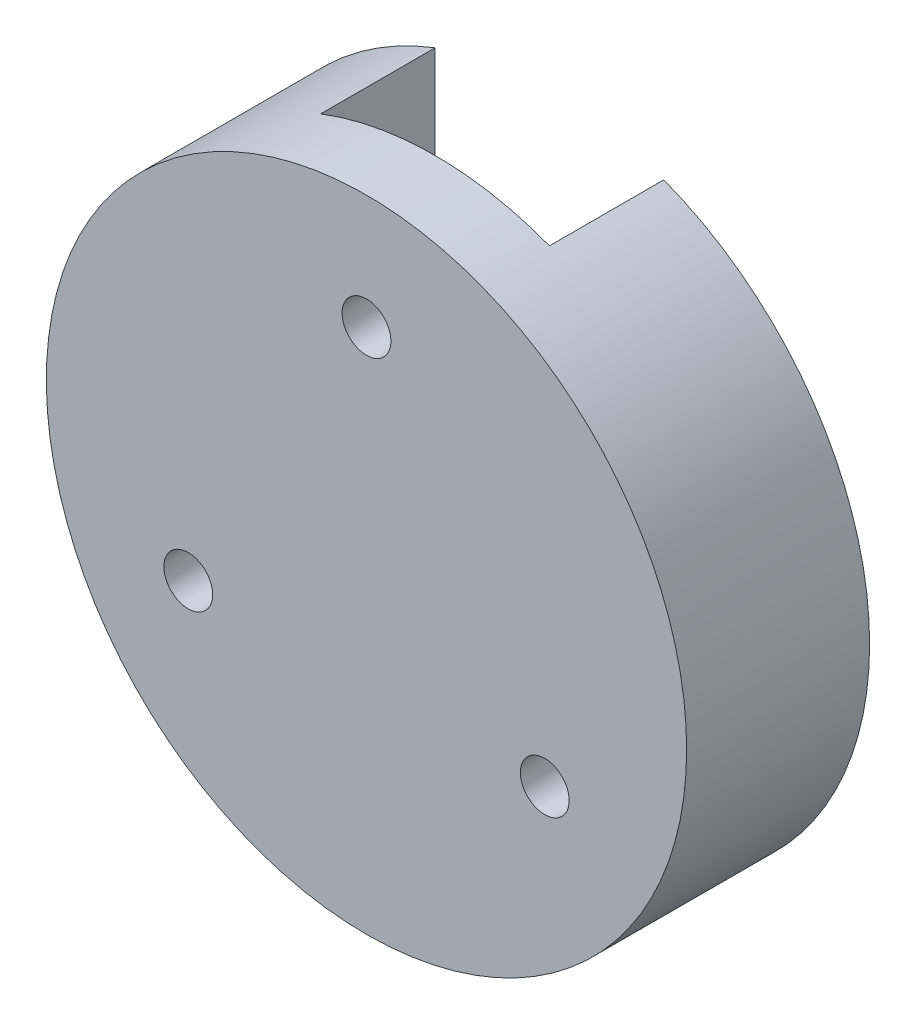
ISO-10303-21;
HEADER;
FILE_DESCRIPTION(('STEP AP214'),'2;1');
FILE_NAME('part.step','',(''),(''),'','','');
FILE_SCHEMA(('AUTOMOTIVE_DESIGN { 1 0 10303 214 1 1 1 1 }'));
ENDSEC;
DATA;
#1=APPLICATION_CONTEXT('core data for automotive mechanical design processes');
#2=APPLICATION_PROTOCOL_DEFINITION('international standard','automotive_design',2000,#1);
#3=PRODUCT_CONTEXT('',#1,'mechanical');
#4=PRODUCT('Part','Part','',(#3));
#5=PRODUCT_RELATED_PRODUCT_CATEGORY('part','',(#4));
#6=PRODUCT_DEFINITION_FORMATION('','',#4);
#7=PRODUCT_DEFINITION_CONTEXT('part definition',#1,'design');
#8=PRODUCT_DEFINITION('design','',#6,#7);
#9=PRODUCT_DEFINITION_SHAPE('','',#8);
#10=(LENGTH_UNIT() NAMED_UNIT(*) SI_UNIT(.MILLI.,.METRE.));
#11=(NAMED_UNIT(*) PLANE_ANGLE_UNIT() SI_UNIT($,.RADIAN.));
#12=(NAMED_UNIT(*) SI_UNIT($,.STERADIAN.) SOLID_ANGLE_UNIT());
#13=UNCERTAINTY_MEASURE_WITH_UNIT(LENGTH_MEASURE(1.E-05),#10,'distance_accuracy_value','');
#14=(GEOMETRIC_REPRESENTATION_CONTEXT(3) GLOBAL_UNCERTAINTY_ASSIGNED_CONTEXT((#13)) GLOBAL_UNIT_ASSIGNED_CONTEXT((#10,
#11,#12)) REPRESENTATION_CONTEXT('',''));
#15=CARTESIAN_POINT('',(0.,0.,0.));
#16=DIRECTION('',(0.,0.,1.));
#17=DIRECTION('',(1.,0.,0.));
#18=AXIS2_PLACEMENT_3D('',#15,#16,#17);
#19=CARTESIAN_POINT('',(0.,0.,-9.));
#20=DIRECTION('',(0.,0.,-1.));
#21=DIRECTION('',(-1.,0.,0.));
#22=AXIS2_PLACEMENT_3D('',#19,#20,#21);
#23=PLANE('',#22);
#24=DIRECTION('',(0.,1.,0.));
#25=VECTOR('',#24,1.);
#26=CARTESIAN_POINT('',(-7.5,-25.,-9.));
#27=LINE('',#26,#25);
#28=CARTESIAN_POINT('',(-7.5,-19.615045245933,-9.));
#29=VERTEX_POINT('',#28);
#30=CARTESIAN_POINT('',(-7.5,19.615045245933,-9.));
#31=VERTEX_POINT('',#30);
#32=EDGE_CURVE('E91',#29,#31,#27,.T.);
#33=ORIENTED_EDGE('',*,*,#32,.F.);
#34=CARTESIAN_POINT('',(0.,0.,-9.));
#35=DIRECTION('',(0.,0.,-1.));
#36=DIRECTION('',(-1.,0.,0.));
#37=AXIS2_PLACEMENT_3D('',#34,#35,#36);
#38=CIRCLE('',#37,21.);
#39=EDGE_CURVE('E104',#29,#31,#38,.T.);
#40=ORIENTED_EDGE('',*,*,#39,.T.);
#41=EDGE_LOOP('',(#33,#40));
#42=FACE_BOUND('',#41,.T.);
#43=CARTESIAN_POINT('',(-11.6913429510908,-6.7499999999995,-9.));
#44=DIRECTION('',(0.,0.,-1.));
#45=DIRECTION('',(-1.,0.,0.));
#46=AXIS2_PLACEMENT_3D('',#43,#44,#45);
#47=CIRCLE('',#46,1.6);
#48=CARTESIAN_POINT('',(-13.2913429510908,-6.7499999999995,-9.));
#49=VERTEX_POINT('',#48);
#50=EDGE_CURVE('E127',#49,#49,#47,.T.);
#51=ORIENTED_EDGE('',*,*,#50,.F.);
#52=EDGE_LOOP('',(#51));
#53=FACE_BOUND('',#52,.T.);
#54=ADVANCED_FACE('F45',(#42,#53),#23,.T.);
#55=CARTESIAN_POINT('',(0.,0.,3.));
#56=DIRECTION('',(0.,0.,-1.));
#57=DIRECTION('',(-1.,0.,0.));
#58=AXIS2_PLACEMENT_3D('',#55,#56,#57);
#59=CYLINDRICAL_SURFACE('',#58,21.);
#60=CARTESIAN_POINT('',(0.,0.,-1.5));
#61=DIRECTION('',(0.,0.,1.));
#62=DIRECTION('',(1.,0.,0.));
#63=AXIS2_PLACEMENT_3D('',#60,#61,#62);
#64=CIRCLE('',#63,21.);
#65=CARTESIAN_POINT('',(7.5,19.615045245933,-1.5));
#66=VERTEX_POINT('',#65);
#67=CARTESIAN_POINT('',(-7.5,19.615045245933,-1.5));
#68=VERTEX_POINT('',#67);
#69=EDGE_CURVE('E141',#66,#68,#64,.T.);
#70=ORIENTED_EDGE('',*,*,#69,.T.);
#71=DIRECTION('',(0.,0.,-1.));
#72=VECTOR('',#71,1.);
#73=CARTESIAN_POINT('',(-7.5,19.615045245933,3.));
#74=LINE('',#73,#72);
#75=EDGE_CURVE('E99',#68,#31,#74,.T.);
#76=ORIENTED_EDGE('',*,*,#75,.T.);
#77=ORIENTED_EDGE('',*,*,#39,.F.);
#78=DIRECTION('',(0.,0.,-1.));
#79=VECTOR('',#78,1.);
#80=CARTESIAN_POINT('',(-7.5,-19.615045245933,3.));
#81=LINE('',#80,#79);
#82=CARTESIAN_POINT('',(-7.5,-19.615045245933,-1.5));
#83=VERTEX_POINT('',#82);
#84=EDGE_CURVE('E88',#29,#83,#81,.F.);
#85=ORIENTED_EDGE('',*,*,#84,.T.);
#86=CARTESIAN_POINT('',(7.5,-19.615045245933,-1.5));
#87=VERTEX_POINT('',#86);
#88=EDGE_CURVE('E142',#83,#87,#64,.T.);
#89=ORIENTED_EDGE('',*,*,#88,.T.);
#90=DIRECTION('',(0.,0.,-1.));
#91=VECTOR('',#90,1.);
#92=CARTESIAN_POINT('',(7.5,-19.615045245933,3.));
#93=LINE('',#92,#91);
#94=CARTESIAN_POINT('',(7.5,-19.615045245933,-9.));
#95=VERTEX_POINT('',#94);
#96=EDGE_CURVE('E67',#87,#95,#93,.T.);
#97=ORIENTED_EDGE('',*,*,#96,.T.);
#98=CARTESIAN_POINT('',(7.5,19.615045245933,-9.));
#99=VERTEX_POINT('',#98);
#100=EDGE_CURVE('E55',#99,#95,#38,.T.);
#101=ORIENTED_EDGE('',*,*,#100,.F.);
#102=DIRECTION('',(0.,0.,-1.));
#103=VECTOR('',#102,1.);
#104=CARTESIAN_POINT('',(7.5,19.615045245933,3.));
#105=LINE('',#104,#103);
#106=EDGE_CURVE('E62',#99,#66,#105,.F.);
#107=ORIENTED_EDGE('',*,*,#106,.T.);
#108=EDGE_LOOP('',(#70,#76,#77,#85,#89,#97,#101,#107));
#109=FACE_BOUND('',#108,.T.);
#110=CARTESIAN_POINT('',(0.,0.,3.));
#111=DIRECTION('',(0.,0.,1.));
#112=DIRECTION('',(1.,0.,0.));
#113=AXIS2_PLACEMENT_3D('',#110,#111,#112);
#114=CIRCLE('',#113,21.);
#115=CARTESIAN_POINT('',(21.,0.,3.));
#116=VERTEX_POINT('',#115);
#117=EDGE_CURVE('E11',#116,#116,#114,.T.);
#118=ORIENTED_EDGE('',*,*,#117,.F.);
#119=EDGE_LOOP('',(#118));
#120=FACE_BOUND('',#119,.T.);
#121=ADVANCED_FACE('F47',(#109,#120),#59,.T.);
#122=CARTESIAN_POINT('',(0.,0.,3.));
#123=DIRECTION('',(0.,0.,1.));
#124=DIRECTION('',(1.,0.,0.));
#125=AXIS2_PLACEMENT_3D('',#122,#123,#124);
#126=PLANE('',#125);
#127=CARTESIAN_POINT('',(0.,13.5,3.));
#128=DIRECTION('',(0.,0.,1.));
#129=DIRECTION('',(1.,0.,0.));
#130=AXIS2_PLACEMENT_3D('',#127,#128,#129);
#131=CIRCLE('',#130,1.6);
#132=CARTESIAN_POINT('',(1.6,13.5,3.));
#133=VERTEX_POINT('',#132);
#134=EDGE_CURVE('E111',#133,#133,#131,.T.);
#135=ORIENTED_EDGE('',*,*,#134,.F.);
#136=EDGE_LOOP('',(#135));
#137=FACE_BOUND('',#136,.T.);
#138=CARTESIAN_POINT('',(-11.6913429510908,-6.7499999999995,3.));
#139=DIRECTION('',(0.,0.,1.));
#140=DIRECTION('',(1.,0.,0.));
#141=AXIS2_PLACEMENT_3D('',#138,#139,#140);
#142=CIRCLE('',#141,1.6);
#143=CARTESIAN_POINT('',(-10.0913429510908,-6.7499999999995,3.));
#144=VERTEX_POINT('',#143);
#145=EDGE_CURVE('E117',#144,#144,#142,.T.);
#146=ORIENTED_EDGE('',*,*,#145,.F.);
#147=EDGE_LOOP('',(#146));
#148=FACE_BOUND('',#147,.T.);
#149=CARTESIAN_POINT('',(11.6913429510891,-6.75000000000049,3.));
#150=DIRECTION('',(0.,0.,1.));
#151=DIRECTION('',(1.,0.,0.));
#152=AXIS2_PLACEMENT_3D('',#149,#150,#151);
#153=CIRCLE('',#152,1.6);
#154=CARTESIAN_POINT('',(13.2913429510891,-6.75000000000049,3.));
#155=VERTEX_POINT('',#154);
#156=EDGE_CURVE('E123',#155,#155,#153,.T.);
#157=ORIENTED_EDGE('',*,*,#156,.F.);
#158=EDGE_LOOP('',(#157));
#159=FACE_BOUND('',#158,.T.);
#160=ORIENTED_EDGE('',*,*,#117,.T.);
#161=EDGE_LOOP('',(#160));
#162=FACE_BOUND('',#161,.T.);
#163=ADVANCED_FACE('F176',(#137,#148,#159,#162),#126,.T.);
#164=DIRECTION('',(0.,-1.,0.));
#165=VECTOR('',#164,1.);
#166=CARTESIAN_POINT('',(7.5,-25.,-9.));
#167=LINE('',#166,#165);
#168=EDGE_CURVE('E106',#99,#95,#167,.T.);
#169=ORIENTED_EDGE('',*,*,#168,.F.);
#170=ORIENTED_EDGE('',*,*,#100,.T.);
#171=EDGE_LOOP('',(#169,#170));
#172=FACE_BOUND('',#171,.T.);
#173=CARTESIAN_POINT('',(11.6913429510891,-6.75000000000049,-9.));
#174=DIRECTION('',(0.,0.,-1.));
#175=DIRECTION('',(-1.,0.,0.));
#176=AXIS2_PLACEMENT_3D('',#173,#174,#175);
#177=CIRCLE('',#176,1.6);
#178=CARTESIAN_POINT('',(10.0913429510891,-6.75000000000049,-9.));
#179=VERTEX_POINT('',#178);
#180=EDGE_CURVE('E128',#179,#179,#177,.T.);
#181=ORIENTED_EDGE('',*,*,#180,.F.);
#182=EDGE_LOOP('',(#181));
#183=FACE_BOUND('',#182,.T.);
#184=ADVANCED_FACE('F171',(#172,#183),#23,.T.);
#185=CARTESIAN_POINT('',(11.6913429510891,-6.75000000000049,17.5));
#186=DIRECTION('',(0.,0.,-1.));
#187=DIRECTION('',(-1.,0.,0.));
#188=AXIS2_PLACEMENT_3D('',#185,#186,#187);
#189=CYLINDRICAL_SURFACE('',#188,1.6);
#190=ORIENTED_EDGE('',*,*,#156,.T.);
#191=EDGE_LOOP('',(#190));
#192=FACE_BOUND('',#191,.T.);
#193=ORIENTED_EDGE('',*,*,#180,.T.);
#194=EDGE_LOOP('',(#193));
#195=FACE_BOUND('',#194,.T.);
#196=ADVANCED_FACE('F179',(#192,#195),#189,.F.);
#197=CARTESIAN_POINT('',(-11.6913429510908,-6.7499999999995,17.5));
#198=DIRECTION('',(0.,0.,-1.));
#199=DIRECTION('',(-1.,0.,0.));
#200=AXIS2_PLACEMENT_3D('',#197,#198,#199);
#201=CYLINDRICAL_SURFACE('',#200,1.6);
#202=ORIENTED_EDGE('',*,*,#145,.T.);
#203=EDGE_LOOP('',(#202));
#204=FACE_BOUND('',#203,.T.);
#205=ORIENTED_EDGE('',*,*,#50,.T.);
#206=EDGE_LOOP('',(#205));
#207=FACE_BOUND('',#206,.T.);
#208=ADVANCED_FACE('F185',(#204,#207),#201,.F.);
#209=CARTESIAN_POINT('',(0.,13.5,17.5));
#210=DIRECTION('',(0.,0.,-1.));
#211=DIRECTION('',(-1.,0.,0.));
#212=AXIS2_PLACEMENT_3D('',#209,#210,#211);
#213=CYLINDRICAL_SURFACE('',#212,1.6);
#214=CARTESIAN_POINT('',(0.,13.5,-1.5));
#215=DIRECTION('',(0.,0.,1.));
#216=DIRECTION('',(1.,0.,0.));
#217=AXIS2_PLACEMENT_3D('',#214,#215,#216);
#218=CIRCLE('',#217,1.6);
#219=CARTESIAN_POINT('',(1.6,13.5,-1.5));
#220=VERTEX_POINT('',#219);
#221=EDGE_CURVE('E49',#220,#220,#218,.F.);
#222=ORIENTED_EDGE('',*,*,#221,.T.);
#223=EDGE_LOOP('',(#222));
#224=FACE_BOUND('',#223,.T.);
#225=ORIENTED_EDGE('',*,*,#134,.T.);
#226=EDGE_LOOP('',(#225));
#227=FACE_BOUND('',#226,.T.);
#228=ADVANCED_FACE('F159',(#224,#227),#213,.F.);
#229=CARTESIAN_POINT('',(-7.5,-25.,-1.5));
#230=DIRECTION('',(-1.,0.,0.));
#231=DIRECTION('',(0.,0.,1.));
#232=AXIS2_PLACEMENT_3D('',#229,#230,#231);
#233=PLANE('',#232);
#234=DIRECTION('',(0.,1.,0.));
#235=VECTOR('',#234,1.);
#236=CARTESIAN_POINT('',(-7.5,-25.,-1.5));
#237=LINE('',#236,#235);
#238=EDGE_CURVE('E94',#83,#68,#237,.T.);
#239=ORIENTED_EDGE('',*,*,#238,.F.);
#240=ORIENTED_EDGE('',*,*,#84,.F.);
#241=ORIENTED_EDGE('',*,*,#32,.T.);
#242=ORIENTED_EDGE('',*,*,#75,.F.);
#243=EDGE_LOOP('',(#239,#240,#241,#242));
#244=FACE_BOUND('',#243,.T.);
#245=ADVANCED_FACE('F90',(#244),#233,.F.);
#246=CARTESIAN_POINT('',(7.5,-25.,-1.5));
#247=DIRECTION('',(1.,0.,0.));
#248=DIRECTION('',(0.,0.,-1.));
#249=AXIS2_PLACEMENT_3D('',#246,#247,#248);
#250=PLANE('',#249);
#251=DIRECTION('',(0.,-1.,0.));
#252=VECTOR('',#251,1.);
#253=CARTESIAN_POINT('',(7.5,-25.,-1.5));
#254=LINE('',#253,#252);
#255=EDGE_CURVE('E147',#66,#87,#254,.T.);
#256=ORIENTED_EDGE('',*,*,#255,.F.);
#257=ORIENTED_EDGE('',*,*,#106,.F.);
#258=ORIENTED_EDGE('',*,*,#168,.T.);
#259=ORIENTED_EDGE('',*,*,#96,.F.);
#260=EDGE_LOOP('',(#256,#257,#258,#259));
#261=FACE_BOUND('',#260,.T.);
#262=ADVANCED_FACE('F163',(#261),#250,.F.);
#263=CARTESIAN_POINT('',(0.,0.,-1.5));
#264=DIRECTION('',(0.,0.,1.));
#265=DIRECTION('',(1.,0.,0.));
#266=AXIS2_PLACEMENT_3D('',#263,#264,#265);
#267=PLANE('',#266);
#268=ORIENTED_EDGE('',*,*,#221,.F.);
#269=EDGE_LOOP('',(#268));
#270=FACE_BOUND('',#269,.T.);
#271=ORIENTED_EDGE('',*,*,#255,.T.);
#272=ORIENTED_EDGE('',*,*,#88,.F.);
#273=ORIENTED_EDGE('',*,*,#238,.T.);
#274=ORIENTED_EDGE('',*,*,#69,.F.);
#275=EDGE_LOOP('',(#271,#272,#273,#274));
#276=FACE_BOUND('',#275,.T.);
#277=ADVANCED_FACE('F152',(#270,#276),#267,.F.);
#278=CLOSED_SHELL('',(#54,#121,#163,#184,#196,#208,#228,#245,#262,#277));
#279=MANIFOLD_SOLID_BREP('B2',#278);
#280=ADVANCED_BREP_SHAPE_REPRESENTATION('',(#18,#279),#14);
#281=SHAPE_DEFINITION_REPRESENTATION(#9,#280);
ENDSEC;
END-ISO-10303-21;
